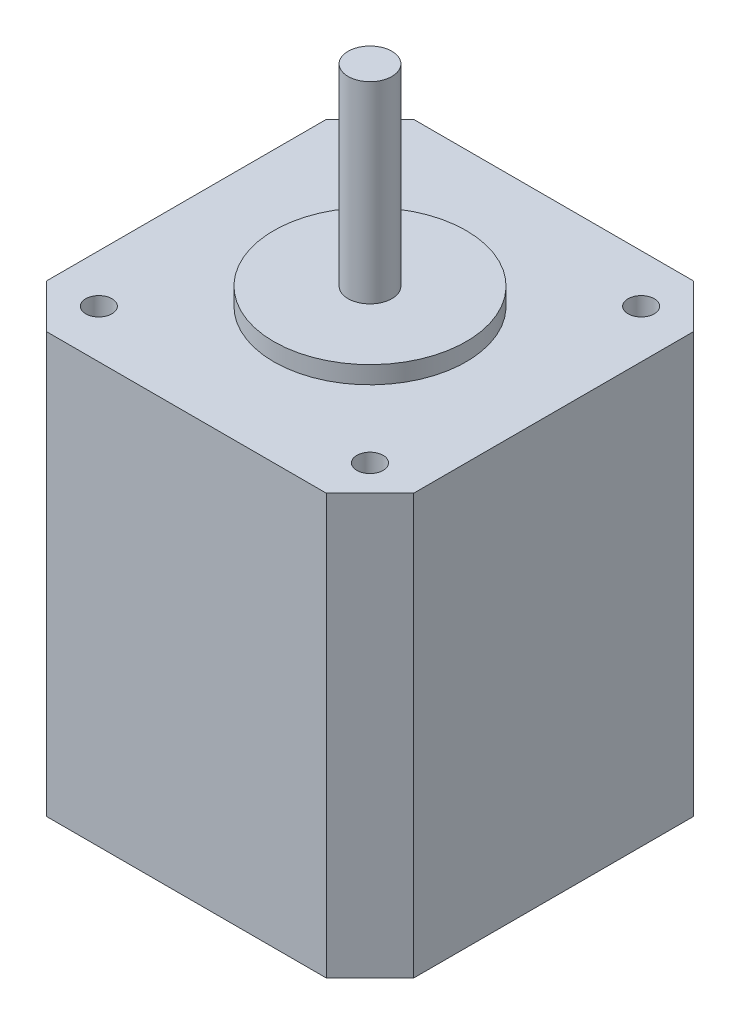
ISO-10303-21;
HEADER;
FILE_DESCRIPTION(('STEP AP214'),'2;1');
FILE_NAME('part.step','',(''),(''),'','','');
FILE_SCHEMA(('AUTOMOTIVE_DESIGN { 1 0 10303 214 1 1 1 1 }'));
ENDSEC;
DATA;
#1=APPLICATION_CONTEXT('core data for automotive mechanical design processes');
#2=APPLICATION_PROTOCOL_DEFINITION('international standard','automotive_design',2000,#1);
#3=PRODUCT_CONTEXT('',#1,'mechanical');
#4=PRODUCT('Part','Part','',(#3));
#5=PRODUCT_RELATED_PRODUCT_CATEGORY('part','',(#4));
#6=PRODUCT_DEFINITION_FORMATION('','',#4);
#7=PRODUCT_DEFINITION_CONTEXT('part definition',#1,'design');
#8=PRODUCT_DEFINITION('design','',#6,#7);
#9=PRODUCT_DEFINITION_SHAPE('','',#8);
#10=(LENGTH_UNIT() NAMED_UNIT(*) SI_UNIT(.MILLI.,.METRE.));
#11=(NAMED_UNIT(*) PLANE_ANGLE_UNIT() SI_UNIT($,.RADIAN.));
#12=(NAMED_UNIT(*) SI_UNIT($,.STERADIAN.) SOLID_ANGLE_UNIT());
#13=UNCERTAINTY_MEASURE_WITH_UNIT(LENGTH_MEASURE(1.E-05),#10,'distance_accuracy_value','');
#14=(GEOMETRIC_REPRESENTATION_CONTEXT(3) GLOBAL_UNCERTAINTY_ASSIGNED_CONTEXT((#13)) GLOBAL_UNIT_ASSIGNED_CONTEXT((#10,
#11,#12)) REPRESENTATION_CONTEXT('',''));
#15=CARTESIAN_POINT('',(0.,0.,0.));
#16=DIRECTION('',(0.,0.,1.));
#17=DIRECTION('',(1.,0.,0.));
#18=AXIS2_PLACEMENT_3D('',#15,#16,#17);
#19=CARTESIAN_POINT('',(21.,50.,-21.));
#20=DIRECTION('',(0.,1.,0.));
#21=DIRECTION('',(0.,0.,1.));
#22=AXIS2_PLACEMENT_3D('',#19,#20,#21);
#23=PLANE('',#22);
#24=CARTESIAN_POINT('',(21.,50.,-21.));
#25=DIRECTION('',(0.,1.,0.));
#26=DIRECTION('',(0.,0.,1.));
#27=AXIS2_PLACEMENT_3D('',#24,#25,#26);
#28=CIRCLE('',#27,11.);
#29=CARTESIAN_POINT('',(21.,50.,-10.));
#30=VERTEX_POINT('',#29);
#31=EDGE_CURVE('E199',#30,#30,#28,.T.);
#32=ORIENTED_EDGE('',*,*,#31,.T.);
#33=EDGE_LOOP('',(#32));
#34=FACE_BOUND('',#33,.T.);
#35=CARTESIAN_POINT('',(21.,50.,-21.));
#36=DIRECTION('',(0.,1.,0.));
#37=DIRECTION('',(0.,0.,1.));
#38=AXIS2_PLACEMENT_3D('',#35,#36,#37);
#39=CIRCLE('',#38,2.5);
#40=CARTESIAN_POINT('',(21.,50.,-18.5));
#41=VERTEX_POINT('',#40);
#42=EDGE_CURVE('E205',#41,#41,#39,.T.);
#43=ORIENTED_EDGE('',*,*,#42,.F.);
#44=EDGE_LOOP('',(#43));
#45=FACE_BOUND('',#44,.T.);
#46=ADVANCED_FACE('F33',(#34,#45),#23,.T.);
#47=CARTESIAN_POINT('',(0.,48.,0.));
#48=DIRECTION('',(0.,-1.,0.));
#49=DIRECTION('',(0.,0.,-1.));
#50=AXIS2_PLACEMENT_3D('',#47,#48,#49);
#51=PLANE('',#50);
#52=DIRECTION('',(-1.,0.,0.));
#53=VECTOR('',#52,1.);
#54=CARTESIAN_POINT('',(0.,48.,-42.));
#55=LINE('',#54,#53);
#56=CARTESIAN_POINT('',(37.,48.,-42.));
#57=VERTEX_POINT('',#56);
#58=CARTESIAN_POINT('',(5.00000000000002,48.,-42.));
#59=VERTEX_POINT('',#58);
#60=EDGE_CURVE('E137',#57,#59,#55,.T.);
#61=ORIENTED_EDGE('',*,*,#60,.T.);
#62=DIRECTION('',(0.70710678118655,0.,-0.707106781186546));
#63=VECTOR('',#62,1.);
#64=CARTESIAN_POINT('',(0.,48.,-37.));
#65=LINE('',#64,#63);
#66=CARTESIAN_POINT('',(0.,48.,-37.));
#67=VERTEX_POINT('',#66);
#68=EDGE_CURVE('E155',#59,#67,#65,.F.);
#69=ORIENTED_EDGE('',*,*,#68,.T.);
#70=DIRECTION('',(0.,0.,1.));
#71=VECTOR('',#70,1.);
#72=CARTESIAN_POINT('',(0.,48.,0.));
#73=LINE('',#72,#71);
#74=CARTESIAN_POINT('',(0.,48.,-5.00000000000002));
#75=VERTEX_POINT('',#74);
#76=EDGE_CURVE('E120',#67,#75,#73,.T.);
#77=ORIENTED_EDGE('',*,*,#76,.T.);
#78=DIRECTION('',(-0.707106781186547,0.,-0.707106781186549));
#79=VECTOR('',#78,1.);
#80=CARTESIAN_POINT('',(5.,48.,0.));
#81=LINE('',#80,#79);
#82=CARTESIAN_POINT('',(5.,48.,0.));
#83=VERTEX_POINT('',#82);
#84=EDGE_CURVE('E151',#75,#83,#81,.F.);
#85=ORIENTED_EDGE('',*,*,#84,.T.);
#86=DIRECTION('',(1.,0.,0.));
#87=VECTOR('',#86,1.);
#88=CARTESIAN_POINT('',(0.,48.,0.));
#89=LINE('',#88,#87);
#90=CARTESIAN_POINT('',(37.,48.,0.));
#91=VERTEX_POINT('',#90);
#92=EDGE_CURVE('E168',#83,#91,#89,.T.);
#93=ORIENTED_EDGE('',*,*,#92,.T.);
#94=DIRECTION('',(-0.707106781186549,0.,0.707106781186547));
#95=VECTOR('',#94,1.);
#96=CARTESIAN_POINT('',(42.,48.,-5.));
#97=LINE('',#96,#95);
#98=CARTESIAN_POINT('',(42.,48.,-5.));
#99=VERTEX_POINT('',#98);
#100=EDGE_CURVE('E55',#91,#99,#97,.F.);
#101=ORIENTED_EDGE('',*,*,#100,.T.);
#102=DIRECTION('',(0.,0.,-1.));
#103=VECTOR('',#102,1.);
#104=CARTESIAN_POINT('',(42.,48.,0.));
#105=LINE('',#104,#103);
#106=CARTESIAN_POINT('',(42.,48.,-37.));
#107=VERTEX_POINT('',#106);
#108=EDGE_CURVE('E175',#99,#107,#105,.T.);
#109=ORIENTED_EDGE('',*,*,#108,.T.);
#110=DIRECTION('',(0.707106781186546,0.,0.70710678118655));
#111=VECTOR('',#110,1.);
#112=CARTESIAN_POINT('',(37.,48.,-42.));
#113=LINE('',#112,#111);
#114=EDGE_CURVE('E153',#107,#57,#113,.F.);
#115=ORIENTED_EDGE('',*,*,#114,.T.);
#116=EDGE_LOOP('',(#61,#69,#77,#85,#93,#101,#109,#115));
#117=FACE_BOUND('',#116,.T.);
#118=CARTESIAN_POINT('',(5.49999999999999,48.,-36.5));
#119=DIRECTION('',(0.,1.,0.));
#120=DIRECTION('',(0.,0.,1.));
#121=AXIS2_PLACEMENT_3D('',#118,#119,#120);
#122=CIRCLE('',#121,1.5);
#123=CARTESIAN_POINT('',(5.49999999999999,48.,-35.));
#124=VERTEX_POINT('',#123);
#125=EDGE_CURVE('E134',#124,#124,#122,.T.);
#126=ORIENTED_EDGE('',*,*,#125,.F.);
#127=EDGE_LOOP('',(#126));
#128=FACE_BOUND('',#127,.T.);
#129=CARTESIAN_POINT('',(36.5,48.,-36.5));
#130=DIRECTION('',(0.,1.,0.));
#131=DIRECTION('',(0.,0.,1.));
#132=AXIS2_PLACEMENT_3D('',#129,#130,#131);
#133=CIRCLE('',#132,1.5);
#134=CARTESIAN_POINT('',(36.5,48.,-35.));
#135=VERTEX_POINT('',#134);
#136=EDGE_CURVE('E184',#135,#135,#133,.T.);
#137=ORIENTED_EDGE('',*,*,#136,.F.);
#138=EDGE_LOOP('',(#137));
#139=FACE_BOUND('',#138,.T.);
#140=CARTESIAN_POINT('',(5.5,48.,-5.50000000000002));
#141=DIRECTION('',(0.,1.,0.));
#142=DIRECTION('',(0.,0.,1.));
#143=AXIS2_PLACEMENT_3D('',#140,#141,#142);
#144=CIRCLE('',#143,1.5);
#145=CARTESIAN_POINT('',(5.5,48.,-4.00000000000002));
#146=VERTEX_POINT('',#145);
#147=EDGE_CURVE('E190',#146,#146,#144,.T.);
#148=ORIENTED_EDGE('',*,*,#147,.F.);
#149=EDGE_LOOP('',(#148));
#150=FACE_BOUND('',#149,.T.);
#151=CARTESIAN_POINT('',(36.5,48.,-5.50000000000001));
#152=DIRECTION('',(0.,1.,0.));
#153=DIRECTION('',(0.,0.,1.));
#154=AXIS2_PLACEMENT_3D('',#151,#152,#153);
#155=CIRCLE('',#154,1.5);
#156=CARTESIAN_POINT('',(36.5,48.,-4.00000000000001));
#157=VERTEX_POINT('',#156);
#158=EDGE_CURVE('E196',#157,#157,#155,.T.);
#159=ORIENTED_EDGE('',*,*,#158,.F.);
#160=EDGE_LOOP('',(#159));
#161=FACE_BOUND('',#160,.T.);
#162=CARTESIAN_POINT('',(21.,48.,-21.));
#163=DIRECTION('',(0.,-1.,0.));
#164=DIRECTION('',(0.,0.,-1.));
#165=AXIS2_PLACEMENT_3D('',#162,#163,#164);
#166=CIRCLE('',#165,11.);
#167=CARTESIAN_POINT('',(21.,48.,-32.));
#168=VERTEX_POINT('',#167);
#169=EDGE_CURVE('E11',#168,#168,#166,.F.);
#170=ORIENTED_EDGE('',*,*,#169,.F.);
#171=EDGE_LOOP('',(#170));
#172=FACE_BOUND('',#171,.T.);
#173=ADVANCED_FACE('F221',(#117,#128,#139,#150,#161,#172),#51,.F.);
#174=CARTESIAN_POINT('',(0.,48.,0.));
#175=DIRECTION('',(1.,0.,0.));
#176=DIRECTION('',(0.,0.,-1.));
#177=AXIS2_PLACEMENT_3D('',#174,#175,#176);
#178=PLANE('',#177);
#179=ORIENTED_EDGE('',*,*,#76,.F.);
#180=DIRECTION('',(0.,-1.,0.));
#181=VECTOR('',#180,1.);
#182=CARTESIAN_POINT('',(0.,48.,-37.));
#183=LINE('',#182,#181);
#184=CARTESIAN_POINT('',(0.,0.,-37.));
#185=VERTEX_POINT('',#184);
#186=EDGE_CURVE('E104',#67,#185,#183,.T.);
#187=ORIENTED_EDGE('',*,*,#186,.T.);
#188=DIRECTION('',(0.,0.,1.));
#189=VECTOR('',#188,1.);
#190=CARTESIAN_POINT('',(0.,0.,0.));
#191=LINE('',#190,#189);
#192=CARTESIAN_POINT('',(0.,0.,-5.00000000000002));
#193=VERTEX_POINT('',#192);
#194=EDGE_CURVE('E117',#185,#193,#191,.T.);
#195=ORIENTED_EDGE('',*,*,#194,.T.);
#196=DIRECTION('',(0.,1.,0.));
#197=VECTOR('',#196,1.);
#198=CARTESIAN_POINT('',(0.,48.,-5.00000000000002));
#199=LINE('',#198,#197);
#200=EDGE_CURVE('E122',#193,#75,#199,.T.);
#201=ORIENTED_EDGE('',*,*,#200,.T.);
#202=EDGE_LOOP('',(#179,#187,#195,#201));
#203=FACE_BOUND('',#202,.T.);
#204=ADVANCED_FACE('F116',(#203),#178,.F.);
#205=CARTESIAN_POINT('',(0.,48.,0.));
#206=DIRECTION('',(0.,0.,-1.));
#207=DIRECTION('',(-1.,0.,0.));
#208=AXIS2_PLACEMENT_3D('',#205,#206,#207);
#209=PLANE('',#208);
#210=ORIENTED_EDGE('',*,*,#92,.F.);
#211=DIRECTION('',(0.,-1.,0.));
#212=VECTOR('',#211,1.);
#213=CARTESIAN_POINT('',(5.,48.,0.));
#214=LINE('',#213,#212);
#215=CARTESIAN_POINT('',(5.,0.,0.));
#216=VERTEX_POINT('',#215);
#217=EDGE_CURVE('E41',#83,#216,#214,.T.);
#218=ORIENTED_EDGE('',*,*,#217,.T.);
#219=DIRECTION('',(1.,0.,0.));
#220=VECTOR('',#219,1.);
#221=CARTESIAN_POINT('',(0.,0.,0.));
#222=LINE('',#221,#220);
#223=CARTESIAN_POINT('',(37.,0.,0.));
#224=VERTEX_POINT('',#223);
#225=EDGE_CURVE('E127',#216,#224,#222,.T.);
#226=ORIENTED_EDGE('',*,*,#225,.T.);
#227=DIRECTION('',(0.,1.,0.));
#228=VECTOR('',#227,1.);
#229=CARTESIAN_POINT('',(37.,48.,0.));
#230=LINE('',#229,#228);
#231=EDGE_CURVE('E161',#224,#91,#230,.T.);
#232=ORIENTED_EDGE('',*,*,#231,.T.);
#233=EDGE_LOOP('',(#210,#218,#226,#232));
#234=FACE_BOUND('',#233,.T.);
#235=ADVANCED_FACE('F166',(#234),#209,.F.);
#236=CARTESIAN_POINT('',(42.,48.,0.));
#237=DIRECTION('',(-1.,0.,0.));
#238=DIRECTION('',(0.,0.,1.));
#239=AXIS2_PLACEMENT_3D('',#236,#237,#238);
#240=PLANE('',#239);
#241=DIRECTION('',(0.,0.,-1.));
#242=VECTOR('',#241,1.);
#243=CARTESIAN_POINT('',(42.,0.,0.));
#244=LINE('',#243,#242);
#245=CARTESIAN_POINT('',(42.,0.,-5.00000000000001));
#246=VERTEX_POINT('',#245);
#247=CARTESIAN_POINT('',(42.,0.,-37.));
#248=VERTEX_POINT('',#247);
#249=EDGE_CURVE('E131',#246,#248,#244,.T.);
#250=ORIENTED_EDGE('',*,*,#249,.T.);
#251=DIRECTION('',(0.,1.,0.));
#252=VECTOR('',#251,1.);
#253=CARTESIAN_POINT('',(42.,48.,-37.));
#254=LINE('',#253,#252);
#255=EDGE_CURVE('E48',#248,#107,#254,.T.);
#256=ORIENTED_EDGE('',*,*,#255,.T.);
#257=ORIENTED_EDGE('',*,*,#108,.F.);
#258=DIRECTION('',(0.,-1.,0.));
#259=VECTOR('',#258,1.);
#260=CARTESIAN_POINT('',(42.,48.,-5.));
#261=LINE('',#260,#259);
#262=EDGE_CURVE('E157',#99,#246,#261,.T.);
#263=ORIENTED_EDGE('',*,*,#262,.T.);
#264=EDGE_LOOP('',(#250,#256,#257,#263));
#265=FACE_BOUND('',#264,.T.);
#266=ADVANCED_FACE('F174',(#265),#240,.F.);
#267=CARTESIAN_POINT('',(0.,48.,-42.));
#268=DIRECTION('',(0.,0.,1.));
#269=DIRECTION('',(1.,0.,0.));
#270=AXIS2_PLACEMENT_3D('',#267,#268,#269);
#271=PLANE('',#270);
#272=DIRECTION('',(-1.,0.,0.));
#273=VECTOR('',#272,1.);
#274=CARTESIAN_POINT('',(0.,0.,-42.));
#275=LINE('',#274,#273);
#276=CARTESIAN_POINT('',(37.,0.,-42.));
#277=VERTEX_POINT('',#276);
#278=CARTESIAN_POINT('',(5.00000000000002,0.,-42.));
#279=VERTEX_POINT('',#278);
#280=EDGE_CURVE('E141',#277,#279,#275,.T.);
#281=ORIENTED_EDGE('',*,*,#280,.T.);
#282=DIRECTION('',(0.,1.,0.));
#283=VECTOR('',#282,1.);
#284=CARTESIAN_POINT('',(5.00000000000002,48.,-42.));
#285=LINE('',#284,#283);
#286=EDGE_CURVE('E105',#279,#59,#285,.T.);
#287=ORIENTED_EDGE('',*,*,#286,.T.);
#288=ORIENTED_EDGE('',*,*,#60,.F.);
#289=DIRECTION('',(0.,-1.,0.));
#290=VECTOR('',#289,1.);
#291=CARTESIAN_POINT('',(37.,48.,-42.));
#292=LINE('',#291,#290);
#293=EDGE_CURVE('E110',#57,#277,#292,.T.);
#294=ORIENTED_EDGE('',*,*,#293,.T.);
#295=EDGE_LOOP('',(#281,#287,#288,#294));
#296=FACE_BOUND('',#295,.T.);
#297=ADVANCED_FACE('F267',(#296),#271,.F.);
#298=CARTESIAN_POINT('',(0.,0.,0.));
#299=DIRECTION('',(0.,-1.,0.));
#300=DIRECTION('',(0.,0.,-1.));
#301=AXIS2_PLACEMENT_3D('',#298,#299,#300);
#302=PLANE('',#301);
#303=ORIENTED_EDGE('',*,*,#194,.F.);
#304=DIRECTION('',(-0.70710678118655,0.,0.707106781186546));
#305=VECTOR('',#304,1.);
#306=CARTESIAN_POINT('',(-18.5,0.,-18.5000000000001));
#307=LINE('',#306,#305);
#308=EDGE_CURVE('E100',#185,#279,#307,.F.);
#309=ORIENTED_EDGE('',*,*,#308,.T.);
#310=ORIENTED_EDGE('',*,*,#280,.F.);
#311=DIRECTION('',(-0.707106781186546,0.,-0.70710678118655));
#312=VECTOR('',#311,1.);
#313=CARTESIAN_POINT('',(39.5000000000001,0.,-39.4999999999999));
#314=LINE('',#313,#312);
#315=EDGE_CURVE('E111',#277,#248,#314,.F.);
#316=ORIENTED_EDGE('',*,*,#315,.T.);
#317=ORIENTED_EDGE('',*,*,#249,.F.);
#318=DIRECTION('',(0.707106781186549,0.,-0.707106781186547));
#319=VECTOR('',#318,1.);
#320=CARTESIAN_POINT('',(18.4999999999999,0.,18.5));
#321=LINE('',#320,#319);
#322=EDGE_CURVE('E121',#246,#224,#321,.F.);
#323=ORIENTED_EDGE('',*,*,#322,.T.);
#324=ORIENTED_EDGE('',*,*,#225,.F.);
#325=DIRECTION('',(0.707106781186547,0.,0.707106781186549));
#326=VECTOR('',#325,1.);
#327=CARTESIAN_POINT('',(2.50000000000001,0.,-2.5));
#328=LINE('',#327,#326);
#329=EDGE_CURVE('E126',#216,#193,#328,.F.);
#330=ORIENTED_EDGE('',*,*,#329,.T.);
#331=EDGE_LOOP('',(#303,#309,#310,#316,#317,#323,#324,#330));
#332=FACE_BOUND('',#331,.T.);
#333=ADVANCED_FACE('F124',(#332),#302,.T.);
#334=CARTESIAN_POINT('',(0.,48.,-37.));
#335=DIRECTION('',(0.707106781186545,0.,0.707106781186549));
#336=DIRECTION('',(0.,-1.,0.));
#337=AXIS2_PLACEMENT_3D('',#334,#335,#336);
#338=PLANE('',#337);
#339=ORIENTED_EDGE('',*,*,#68,.F.);
#340=ORIENTED_EDGE('',*,*,#286,.F.);
#341=ORIENTED_EDGE('',*,*,#308,.F.);
#342=ORIENTED_EDGE('',*,*,#186,.F.);
#343=EDGE_LOOP('',(#339,#340,#341,#342));
#344=FACE_BOUND('',#343,.T.);
#345=ADVANCED_FACE('F103',(#344),#338,.F.);
#346=CARTESIAN_POINT('',(37.,48.,-42.));
#347=DIRECTION('',(-0.707106781186549,0.,0.707106781186545));
#348=DIRECTION('',(0.,-1.,0.));
#349=AXIS2_PLACEMENT_3D('',#346,#347,#348);
#350=PLANE('',#349);
#351=ORIENTED_EDGE('',*,*,#114,.F.);
#352=ORIENTED_EDGE('',*,*,#255,.F.);
#353=ORIENTED_EDGE('',*,*,#315,.F.);
#354=ORIENTED_EDGE('',*,*,#293,.F.);
#355=EDGE_LOOP('',(#351,#352,#353,#354));
#356=FACE_BOUND('',#355,.T.);
#357=ADVANCED_FACE('F279',(#356),#350,.F.);
#358=CARTESIAN_POINT('',(5.,48.,0.));
#359=DIRECTION('',(0.707106781186549,0.,-0.707106781186547));
#360=DIRECTION('',(0.,-1.,0.));
#361=AXIS2_PLACEMENT_3D('',#358,#359,#360);
#362=PLANE('',#361);
#363=ORIENTED_EDGE('',*,*,#84,.F.);
#364=ORIENTED_EDGE('',*,*,#200,.F.);
#365=ORIENTED_EDGE('',*,*,#329,.F.);
#366=ORIENTED_EDGE('',*,*,#217,.F.);
#367=EDGE_LOOP('',(#363,#364,#365,#366));
#368=FACE_BOUND('',#367,.T.);
#369=ADVANCED_FACE('F281',(#368),#362,.F.);
#370=CARTESIAN_POINT('',(42.,48.,-5.));
#371=DIRECTION('',(-0.707106781186547,0.,-0.707106781186549));
#372=DIRECTION('',(0.,-1.,0.));
#373=AXIS2_PLACEMENT_3D('',#370,#371,#372);
#374=PLANE('',#373);
#375=ORIENTED_EDGE('',*,*,#100,.F.);
#376=ORIENTED_EDGE('',*,*,#231,.F.);
#377=ORIENTED_EDGE('',*,*,#322,.F.);
#378=ORIENTED_EDGE('',*,*,#262,.F.);
#379=EDGE_LOOP('',(#375,#376,#377,#378));
#380=FACE_BOUND('',#379,.T.);
#381=ADVANCED_FACE('F35',(#380),#374,.F.);
#382=CARTESIAN_POINT('',(5.49999999999999,43.5,-36.5));
#383=DIRECTION('',(0.,1.,0.));
#384=DIRECTION('',(0.,0.,1.));
#385=AXIS2_PLACEMENT_3D('',#382,#383,#384);
#386=CYLINDRICAL_SURFACE('',#385,1.5);
#387=CARTESIAN_POINT('',(5.49999999999999,43.5,-36.5));
#388=DIRECTION('',(0.,1.,0.));
#389=DIRECTION('',(0.,0.,1.));
#390=AXIS2_PLACEMENT_3D('',#387,#388,#389);
#391=CIRCLE('',#390,1.5);
#392=CARTESIAN_POINT('',(5.49999999999999,43.5,-35.));
#393=VERTEX_POINT('',#392);
#394=EDGE_CURVE('E128',#393,#393,#391,.T.);
#395=ORIENTED_EDGE('',*,*,#394,.F.);
#396=EDGE_LOOP('',(#395));
#397=FACE_BOUND('',#396,.T.);
#398=ORIENTED_EDGE('',*,*,#125,.T.);
#399=EDGE_LOOP('',(#398));
#400=FACE_BOUND('',#399,.T.);
#401=ADVANCED_FACE('F260',(#397,#400),#386,.F.);
#402=CARTESIAN_POINT('',(5.49999999999999,43.5,-36.5));
#403=DIRECTION('',(0.,1.,0.));
#404=DIRECTION('',(0.,0.,1.));
#405=AXIS2_PLACEMENT_3D('',#402,#403,#404);
#406=PLANE('',#405);
#407=ORIENTED_EDGE('',*,*,#394,.T.);
#408=EDGE_LOOP('',(#407));
#409=FACE_BOUND('',#408,.T.);
#410=ADVANCED_FACE('F256',(#409),#406,.T.);
#411=CARTESIAN_POINT('',(36.5,43.5,-36.5));
#412=DIRECTION('',(0.,1.,0.));
#413=DIRECTION('',(0.,0.,1.));
#414=AXIS2_PLACEMENT_3D('',#411,#412,#413);
#415=CYLINDRICAL_SURFACE('',#414,1.5);
#416=CARTESIAN_POINT('',(36.5,43.5,-36.5));
#417=DIRECTION('',(0.,1.,0.));
#418=DIRECTION('',(0.,0.,1.));
#419=AXIS2_PLACEMENT_3D('',#416,#417,#418);
#420=CIRCLE('',#419,1.5);
#421=CARTESIAN_POINT('',(36.5,43.5,-35.));
#422=VERTEX_POINT('',#421);
#423=EDGE_CURVE('E182',#422,#422,#420,.T.);
#424=ORIENTED_EDGE('',*,*,#423,.F.);
#425=EDGE_LOOP('',(#424));
#426=FACE_BOUND('',#425,.T.);
#427=ORIENTED_EDGE('',*,*,#136,.T.);
#428=EDGE_LOOP('',(#427));
#429=FACE_BOUND('',#428,.T.);
#430=ADVANCED_FACE('F252',(#426,#429),#415,.F.);
#431=CARTESIAN_POINT('',(36.5,43.5,-36.5));
#432=DIRECTION('',(0.,1.,0.));
#433=DIRECTION('',(0.,0.,1.));
#434=AXIS2_PLACEMENT_3D('',#431,#432,#433);
#435=PLANE('',#434);
#436=ORIENTED_EDGE('',*,*,#423,.T.);
#437=EDGE_LOOP('',(#436));
#438=FACE_BOUND('',#437,.T.);
#439=ADVANCED_FACE('F248',(#438),#435,.T.);
#440=CARTESIAN_POINT('',(5.5,43.5,-5.50000000000002));
#441=DIRECTION('',(0.,1.,0.));
#442=DIRECTION('',(0.,0.,1.));
#443=AXIS2_PLACEMENT_3D('',#440,#441,#442);
#444=CYLINDRICAL_SURFACE('',#443,1.5);
#445=CARTESIAN_POINT('',(5.5,43.5,-5.50000000000002));
#446=DIRECTION('',(0.,1.,0.));
#447=DIRECTION('',(0.,0.,1.));
#448=AXIS2_PLACEMENT_3D('',#445,#446,#447);
#449=CIRCLE('',#448,1.5);
#450=CARTESIAN_POINT('',(5.5,43.5,-4.00000000000002));
#451=VERTEX_POINT('',#450);
#452=EDGE_CURVE('E187',#451,#451,#449,.T.);
#453=ORIENTED_EDGE('',*,*,#452,.F.);
#454=EDGE_LOOP('',(#453));
#455=FACE_BOUND('',#454,.T.);
#456=ORIENTED_EDGE('',*,*,#147,.T.);
#457=EDGE_LOOP('',(#456));
#458=FACE_BOUND('',#457,.T.);
#459=ADVANCED_FACE('F244',(#455,#458),#444,.F.);
#460=CARTESIAN_POINT('',(5.5,43.5,-5.50000000000002));
#461=DIRECTION('',(0.,1.,0.));
#462=DIRECTION('',(0.,0.,1.));
#463=AXIS2_PLACEMENT_3D('',#460,#461,#462);
#464=PLANE('',#463);
#465=ORIENTED_EDGE('',*,*,#452,.T.);
#466=EDGE_LOOP('',(#465));
#467=FACE_BOUND('',#466,.T.);
#468=ADVANCED_FACE('F240',(#467),#464,.T.);
#469=CARTESIAN_POINT('',(36.5,43.5,-5.50000000000001));
#470=DIRECTION('',(0.,1.,0.));
#471=DIRECTION('',(0.,0.,1.));
#472=AXIS2_PLACEMENT_3D('',#469,#470,#471);
#473=CYLINDRICAL_SURFACE('',#472,1.5);
#474=CARTESIAN_POINT('',(36.5,43.5,-5.50000000000001));
#475=DIRECTION('',(0.,1.,0.));
#476=DIRECTION('',(0.,0.,1.));
#477=AXIS2_PLACEMENT_3D('',#474,#475,#476);
#478=CIRCLE('',#477,1.5);
#479=CARTESIAN_POINT('',(36.5,43.5,-4.00000000000001));
#480=VERTEX_POINT('',#479);
#481=EDGE_CURVE('E193',#480,#480,#478,.T.);
#482=ORIENTED_EDGE('',*,*,#481,.F.);
#483=EDGE_LOOP('',(#482));
#484=FACE_BOUND('',#483,.T.);
#485=ORIENTED_EDGE('',*,*,#158,.T.);
#486=EDGE_LOOP('',(#485));
#487=FACE_BOUND('',#486,.T.);
#488=ADVANCED_FACE('F236',(#484,#487),#473,.F.);
#489=CARTESIAN_POINT('',(36.5,43.5,-5.50000000000001));
#490=DIRECTION('',(0.,1.,0.));
#491=DIRECTION('',(0.,0.,1.));
#492=AXIS2_PLACEMENT_3D('',#489,#490,#491);
#493=PLANE('',#492);
#494=ORIENTED_EDGE('',*,*,#481,.T.);
#495=EDGE_LOOP('',(#494));
#496=FACE_BOUND('',#495,.T.);
#497=ADVANCED_FACE('F232',(#496),#493,.T.);
#498=CARTESIAN_POINT('',(21.,50.,-21.));
#499=DIRECTION('',(0.,-1.,0.));
#500=DIRECTION('',(0.,0.,-1.));
#501=AXIS2_PLACEMENT_3D('',#498,#499,#500);
#502=CYLINDRICAL_SURFACE('',#501,11.);
#503=ORIENTED_EDGE('',*,*,#31,.F.);
#504=EDGE_LOOP('',(#503));
#505=FACE_BOUND('',#504,.T.);
#506=ORIENTED_EDGE('',*,*,#169,.T.);
#507=EDGE_LOOP('',(#506));
#508=FACE_BOUND('',#507,.T.);
#509=ADVANCED_FACE('F216',(#505,#508),#502,.T.);
#510=CARTESIAN_POINT('',(21.,72.,-21.));
#511=DIRECTION('',(0.,-1.,0.));
#512=DIRECTION('',(0.,0.,-1.));
#513=AXIS2_PLACEMENT_3D('',#510,#511,#512);
#514=CYLINDRICAL_SURFACE('',#513,2.5);
#515=CARTESIAN_POINT('',(21.,72.,-21.));
#516=DIRECTION('',(0.,1.,0.));
#517=DIRECTION('',(0.,0.,1.));
#518=AXIS2_PLACEMENT_3D('',#515,#516,#517);
#519=CIRCLE('',#518,2.5);
#520=CARTESIAN_POINT('',(21.,72.,-18.5));
#521=VERTEX_POINT('',#520);
#522=EDGE_CURVE('E204',#521,#521,#519,.T.);
#523=ORIENTED_EDGE('',*,*,#522,.F.);
#524=EDGE_LOOP('',(#523));
#525=FACE_BOUND('',#524,.T.);
#526=ORIENTED_EDGE('',*,*,#42,.T.);
#527=EDGE_LOOP('',(#526));
#528=FACE_BOUND('',#527,.T.);
#529=ADVANCED_FACE('F213',(#525,#528),#514,.T.);
#530=CARTESIAN_POINT('',(21.,72.,-21.));
#531=DIRECTION('',(0.,1.,0.));
#532=DIRECTION('',(0.,0.,1.));
#533=AXIS2_PLACEMENT_3D('',#530,#531,#532);
#534=PLANE('',#533);
#535=ORIENTED_EDGE('',*,*,#522,.T.);
#536=EDGE_LOOP('',(#535));
#537=FACE_BOUND('',#536,.T.);
#538=ADVANCED_FACE('F211',(#537),#534,.T.);
#539=CLOSED_SHELL('',(#46,#173,#204,#235,#266,#297,#333,#345,#357,#369,#381,#401,#410,#430,#439,
#459,#468,#488,#497,#509,#529,#538));
#540=MANIFOLD_SOLID_BREP('B2',#539);
#541=ADVANCED_BREP_SHAPE_REPRESENTATION('',(#18,#540),#14);
#542=SHAPE_DEFINITION_REPRESENTATION(#9,#541);
ENDSEC;
END-ISO-10303-21;
